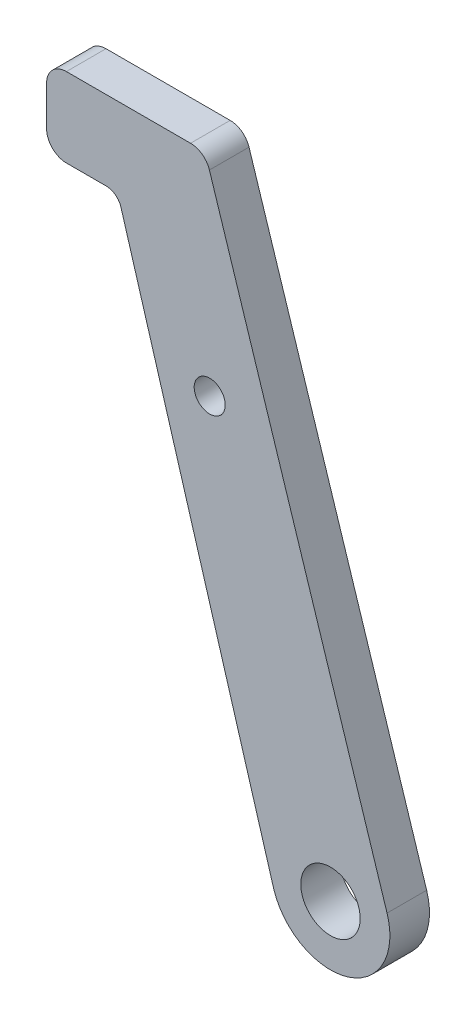
ISO-10303-21;
HEADER;
FILE_DESCRIPTION(('STEP AP214'),'2;1');
FILE_NAME('part.step','',(''),(''),'','','');
FILE_SCHEMA(('AUTOMOTIVE_DESIGN { 1 0 10303 214 1 1 1 1 }'));
ENDSEC;
DATA;
#1=APPLICATION_CONTEXT('core data for automotive mechanical design processes');
#2=APPLICATION_PROTOCOL_DEFINITION('international standard','automotive_design',2000,#1);
#3=PRODUCT_CONTEXT('',#1,'mechanical');
#4=PRODUCT('Part','Part','',(#3));
#5=PRODUCT_RELATED_PRODUCT_CATEGORY('part','',(#4));
#6=PRODUCT_DEFINITION_FORMATION('','',#4);
#7=PRODUCT_DEFINITION_CONTEXT('part definition',#1,'design');
#8=PRODUCT_DEFINITION('design','',#6,#7);
#9=PRODUCT_DEFINITION_SHAPE('','',#8);
#10=(LENGTH_UNIT() NAMED_UNIT(*) SI_UNIT(.MILLI.,.METRE.));
#11=(NAMED_UNIT(*) PLANE_ANGLE_UNIT() SI_UNIT($,.RADIAN.));
#12=(NAMED_UNIT(*) SI_UNIT($,.STERADIAN.) SOLID_ANGLE_UNIT());
#13=UNCERTAINTY_MEASURE_WITH_UNIT(LENGTH_MEASURE(1.E-05),#10,'distance_accuracy_value','');
#14=(GEOMETRIC_REPRESENTATION_CONTEXT(3) GLOBAL_UNCERTAINTY_ASSIGNED_CONTEXT((#13)) GLOBAL_UNIT_ASSIGNED_CONTEXT((#10,
#11,#12)) REPRESENTATION_CONTEXT('',''));
#15=CARTESIAN_POINT('',(0.,0.,0.));
#16=DIRECTION('',(0.,0.,1.));
#17=DIRECTION('',(1.,0.,0.));
#18=AXIS2_PLACEMENT_3D('',#15,#16,#17);
#19=CARTESIAN_POINT('',(56.5878202370331,645.1727,-6.35));
#20=DIRECTION('',(0.,1.,0.));
#21=DIRECTION('',(0.,0.,1.));
#22=AXIS2_PLACEMENT_3D('',#19,#20,#21);
#23=PLANE('',#22);
#24=DIRECTION('',(-1.,0.,0.));
#25=VECTOR('',#24,1.);
#26=CARTESIAN_POINT('',(56.5878202370331,645.1727,0.));
#27=LINE('',#26,#25);
#28=CARTESIAN_POINT('',(79.670778121342,645.1727,0.));
#29=VERTEX_POINT('',#28);
#30=CARTESIAN_POINT('',(59.7628202370331,645.1727,0.));
#31=VERTEX_POINT('',#30);
#32=EDGE_CURVE('E163',#29,#31,#27,.T.);
#33=ORIENTED_EDGE('',*,*,#32,.F.);
#34=DIRECTION('',(0.,0.,1.));
#35=VECTOR('',#34,1.);
#36=CARTESIAN_POINT('',(79.670778121342,645.1727,-6.35));
#37=LINE('',#36,#35);
#38=CARTESIAN_POINT('',(79.670778121342,645.1727,-6.35));
#39=VERTEX_POINT('',#38);
#40=EDGE_CURVE('E11',#29,#39,#37,.F.);
#41=ORIENTED_EDGE('',*,*,#40,.T.);
#42=DIRECTION('',(-1.,0.,0.));
#43=VECTOR('',#42,1.);
#44=CARTESIAN_POINT('',(56.5878202370331,645.1727,-6.35));
#45=LINE('',#44,#43);
#46=CARTESIAN_POINT('',(59.7628202370331,645.1727,-6.35));
#47=VERTEX_POINT('',#46);
#48=EDGE_CURVE('E184',#39,#47,#45,.T.);
#49=ORIENTED_EDGE('',*,*,#48,.T.);
#50=DIRECTION('',(0.,0.,1.));
#51=VECTOR('',#50,1.);
#52=CARTESIAN_POINT('',(59.7628202370331,645.1727,-6.35));
#53=LINE('',#52,#51);
#54=EDGE_CURVE('E47',#47,#31,#53,.T.);
#55=ORIENTED_EDGE('',*,*,#54,.T.);
#56=EDGE_LOOP('',(#33,#41,#49,#55));
#57=FACE_BOUND('',#56,.T.);
#58=ADVANCED_FACE('F39',(#57),#23,.T.);
#59=CARTESIAN_POINT('',(81.987820237033,645.1727,-6.35));
#60=DIRECTION('',(0.952354391814923,0.304993626803623,0.));
#61=DIRECTION('',(-0.304993626803623,0.952354391814923,0.));
#62=AXIS2_PLACEMENT_3D('',#59,#60,#61);
#63=PLANE('',#62);
#64=DIRECTION('',(-0.304993626803623,0.952354391814923,0.));
#65=VECTOR('',#64,1.);
#66=CARTESIAN_POINT('',(81.987820237033,645.1727,-6.35));
#67=LINE('',#66,#65);
#68=CARTESIAN_POINT('',(111.179175582037,554.021564295304,-6.35));
#69=VERTEX_POINT('',#68);
#70=CARTESIAN_POINT('',(82.6945033153544,642.966054765101,-6.35));
#71=VERTEX_POINT('',#70);
#72=EDGE_CURVE('E148',#69,#71,#67,.T.);
#73=ORIENTED_EDGE('',*,*,#72,.T.);
#74=DIRECTION('',(0.,0.,1.));
#75=VECTOR('',#74,1.);
#76=CARTESIAN_POINT('',(82.6945033153544,642.966054765101,-6.35));
#77=LINE('',#76,#75);
#78=CARTESIAN_POINT('',(82.6945033153544,642.966054765101,0.));
#79=VERTEX_POINT('',#78);
#80=EDGE_CURVE('E216',#71,#79,#77,.T.);
#81=ORIENTED_EDGE('',*,*,#80,.T.);
#82=DIRECTION('',(-0.304993626803623,0.952354391814923,0.));
#83=VECTOR('',#82,1.);
#84=CARTESIAN_POINT('',(81.987820237033,645.1727,0.));
#85=LINE('',#84,#83);
#86=CARTESIAN_POINT('',(111.179175582037,554.021564295304,0.));
#87=VERTEX_POINT('',#86);
#88=EDGE_CURVE('E181',#87,#79,#85,.T.);
#89=ORIENTED_EDGE('',*,*,#88,.F.);
#90=DIRECTION('',(0.,0.,1.));
#91=VECTOR('',#90,1.);
#92=CARTESIAN_POINT('',(111.179175582037,554.021564295304,-6.35));
#93=LINE('',#92,#91);
#94=EDGE_CURVE('E185',#69,#87,#93,.T.);
#95=ORIENTED_EDGE('',*,*,#94,.F.);
#96=EDGE_LOOP('',(#73,#81,#89,#95));
#97=FACE_BOUND('',#96,.T.);
#98=ADVANCED_FACE('F236',(#97),#63,.T.);
#99=CARTESIAN_POINT('',(102.108,551.1165,-6.35));
#100=DIRECTION('',(0.,0.,1.));
#101=DIRECTION('',(1.,0.,0.));
#102=AXIS2_PLACEMENT_3D('',#99,#100,#101);
#103=CYLINDRICAL_SURFACE('',#102,9.52500000000003);
#104=CARTESIAN_POINT('',(102.108,551.1165,0.));
#105=DIRECTION('',(0.,0.,1.));
#106=DIRECTION('',(1.,0.,0.));
#107=AXIS2_PLACEMENT_3D('',#104,#105,#106);
#108=CIRCLE('',#107,9.52500000000003);
#109=CARTESIAN_POINT('',(93.0368244179624,548.211435704695,0.));
#110=VERTEX_POINT('',#109);
#111=EDGE_CURVE('E178',#110,#87,#108,.T.);
#112=ORIENTED_EDGE('',*,*,#111,.F.);
#113=DIRECTION('',(0.,0.,1.));
#114=VECTOR('',#113,1.);
#115=CARTESIAN_POINT('',(93.0368244179624,548.211435704695,-6.35));
#116=LINE('',#115,#114);
#117=CARTESIAN_POINT('',(93.0368244179624,548.211435704695,-6.35));
#118=VERTEX_POINT('',#117);
#119=EDGE_CURVE('E188',#118,#110,#116,.T.);
#120=ORIENTED_EDGE('',*,*,#119,.F.);
#121=CARTESIAN_POINT('',(102.108,551.1165,-6.35));
#122=DIRECTION('',(0.,0.,1.));
#123=DIRECTION('',(1.,0.,0.));
#124=AXIS2_PLACEMENT_3D('',#121,#122,#123);
#125=CIRCLE('',#124,9.52500000000003);
#126=EDGE_CURVE('E158',#118,#69,#125,.T.);
#127=ORIENTED_EDGE('',*,*,#126,.T.);
#128=ORIENTED_EDGE('',*,*,#94,.T.);
#129=EDGE_LOOP('',(#112,#120,#127,#128));
#130=FACE_BOUND('',#129,.T.);
#131=ADVANCED_FACE('F283',(#130),#103,.T.);
#132=CARTESIAN_POINT('',(93.0368244179624,548.211435704695,-6.35));
#133=DIRECTION('',(-0.9523543918149,-0.304993626803696,0.));
#134=DIRECTION('',(0.304993626803696,-0.9523543918149,0.));
#135=AXIS2_PLACEMENT_3D('',#132,#133,#134);
#136=PLANE('',#135);
#137=DIRECTION('',(0.304993626803696,-0.9523543918149,0.));
#138=VECTOR('',#137,1.);
#139=CARTESIAN_POINT('',(93.0368244179624,548.211435704695,0.));
#140=LINE('',#139,#138);
#141=CARTESIAN_POINT('',(93.0164969595132,548.274908979634,0.));
#142=VERTEX_POINT('',#141);
#143=EDGE_CURVE('E176',#142,#110,#140,.T.);
#144=ORIENTED_EDGE('',*,*,#143,.F.);
#145=DIRECTION('',(0.,0.,1.));
#146=VECTOR('',#145,1.);
#147=CARTESIAN_POINT('',(93.0164969595132,548.274908979634,-6.35));
#148=LINE('',#147,#146);
#149=CARTESIAN_POINT('',(93.0164969595132,548.274908979634,-6.35));
#150=VERTEX_POINT('',#149);
#151=EDGE_CURVE('E62',#142,#150,#148,.F.);
#152=ORIENTED_EDGE('',*,*,#151,.T.);
#153=DIRECTION('',(0.304993626803696,-0.9523543918149,0.));
#154=VECTOR('',#153,1.);
#155=CARTESIAN_POINT('',(93.0368244179624,548.211435704695,-6.35));
#156=LINE('',#155,#154);
#157=EDGE_CURVE('E153',#150,#118,#156,.T.);
#158=ORIENTED_EDGE('',*,*,#157,.T.);
#159=ORIENTED_EDGE('',*,*,#119,.T.);
#160=EDGE_LOOP('',(#144,#152,#158,#159));
#161=FACE_BOUND('',#160,.T.);
#162=ADVANCED_FACE('F309',(#161),#136,.T.);
#163=CARTESIAN_POINT('',(93.0063332302884,548.306645617103,-6.35));
#164=DIRECTION('',(-0.95854622969434,-0.284937055397793,0.));
#165=DIRECTION('',(0.284937055397793,-0.958546229694341,0.));
#166=AXIS2_PLACEMENT_3D('',#163,#164,#165);
#167=PLANE('',#166);
#168=DIRECTION('',(0.284937055397793,-0.95854622969434,0.));
#169=VECTOR('',#168,1.);
#170=CARTESIAN_POINT('',(93.0063332302884,548.306645617103,-6.35));
#171=LINE('',#170,#169);
#172=CARTESIAN_POINT('',(68.5162693960239,630.692765318296,-6.35));
#173=VERTEX_POINT('',#172);
#174=CARTESIAN_POINT('',(92.996837874246,548.338588593847,-6.35));
#175=VERTEX_POINT('',#174);
#176=EDGE_CURVE('E151',#173,#175,#171,.T.);
#177=ORIENTED_EDGE('',*,*,#176,.T.);
#178=DIRECTION('',(0.,0.,1.));
#179=VECTOR('',#178,1.);
#180=CARTESIAN_POINT('',(92.996837874246,548.338588593847,-6.35));
#181=LINE('',#180,#179);
#182=CARTESIAN_POINT('',(92.996837874246,548.338588593847,0.));
#183=VERTEX_POINT('',#182);
#184=EDGE_CURVE('E212',#175,#183,#181,.T.);
#185=ORIENTED_EDGE('',*,*,#184,.T.);
#186=DIRECTION('',(0.284937055397793,-0.95854622969434,0.));
#187=VECTOR('',#186,1.);
#188=CARTESIAN_POINT('',(93.0063332302884,548.306645617103,0.));
#189=LINE('',#188,#187);
#190=CARTESIAN_POINT('',(68.5162693960239,630.692765318296,0.));
#191=VERTEX_POINT('',#190);
#192=EDGE_CURVE('E173',#191,#183,#189,.T.);
#193=ORIENTED_EDGE('',*,*,#192,.F.);
#194=DIRECTION('',(0.,0.,1.));
#195=VECTOR('',#194,1.);
#196=CARTESIAN_POINT('',(68.5162693960239,630.692765318296,-6.35));
#197=LINE('',#196,#195);
#198=EDGE_CURVE('E147',#173,#191,#197,.T.);
#199=ORIENTED_EDGE('',*,*,#198,.F.);
#200=EDGE_LOOP('',(#177,#185,#193,#199));
#201=FACE_BOUND('',#200,.T.);
#202=ADVANCED_FACE('F306',(#201),#167,.T.);
#203=CARTESIAN_POINT('',(66.1302561210688,629.9835,-6.35));
#204=DIRECTION('',(0.,0.,1.));
#205=DIRECTION('',(1.,0.,0.));
#206=AXIS2_PLACEMENT_3D('',#203,#204,#205);
#207=CYLINDRICAL_SURFACE('',#206,2.48919999999997);
#208=CARTESIAN_POINT('',(66.1302561210688,629.9835,0.));
#209=DIRECTION('',(0.,0.,-1.));
#210=DIRECTION('',(1.,0.,0.));
#211=AXIS2_PLACEMENT_3D('',#208,#209,#210);
#212=CIRCLE('',#211,2.48919999999997);
#213=CARTESIAN_POINT('',(66.1302561210688,632.4727,0.));
#214=VERTEX_POINT('',#213);
#215=EDGE_CURVE('E146',#214,#191,#212,.T.);
#216=ORIENTED_EDGE('',*,*,#215,.F.);
#217=DIRECTION('',(0.,0.,1.));
#218=VECTOR('',#217,1.);
#219=CARTESIAN_POINT('',(66.1302561210688,632.4727,-6.35));
#220=LINE('',#219,#218);
#221=CARTESIAN_POINT('',(66.1302561210688,632.4727,-6.35));
#222=VERTEX_POINT('',#221);
#223=EDGE_CURVE('E133',#222,#214,#220,.T.);
#224=ORIENTED_EDGE('',*,*,#223,.F.);
#225=CARTESIAN_POINT('',(66.1302561210688,629.9835,-6.35));
#226=DIRECTION('',(0.,0.,-1.));
#227=DIRECTION('',(1.,0.,0.));
#228=AXIS2_PLACEMENT_3D('',#225,#226,#227);
#229=CIRCLE('',#228,2.48919999999997);
#230=EDGE_CURVE('E139',#222,#173,#229,.T.);
#231=ORIENTED_EDGE('',*,*,#230,.T.);
#232=ORIENTED_EDGE('',*,*,#198,.T.);
#233=EDGE_LOOP('',(#216,#224,#231,#232));
#234=FACE_BOUND('',#233,.T.);
#235=ADVANCED_FACE('F144',(#234),#207,.F.);
#236=CARTESIAN_POINT('',(66.1302561210688,632.4727,-6.35));
#237=DIRECTION('',(0.,-1.,0.));
#238=DIRECTION('',(1.,0.,0.));
#239=AXIS2_PLACEMENT_3D('',#236,#237,#238);
#240=PLANE('',#239);
#241=DIRECTION('',(1.,0.,0.));
#242=VECTOR('',#241,1.);
#243=CARTESIAN_POINT('',(66.1302561210688,632.4727,0.));
#244=LINE('',#243,#242);
#245=CARTESIAN_POINT('',(59.762820237033,632.4727,0.));
#246=VERTEX_POINT('',#245);
#247=EDGE_CURVE('E170',#246,#214,#244,.T.);
#248=ORIENTED_EDGE('',*,*,#247,.F.);
#249=DIRECTION('',(0.,0.,1.));
#250=VECTOR('',#249,1.);
#251=CARTESIAN_POINT('',(59.762820237033,632.4727,-6.35));
#252=LINE('',#251,#250);
#253=CARTESIAN_POINT('',(59.762820237033,632.4727,-6.35));
#254=VERTEX_POINT('',#253);
#255=EDGE_CURVE('E136',#246,#254,#252,.F.);
#256=ORIENTED_EDGE('',*,*,#255,.T.);
#257=DIRECTION('',(1.,0.,0.));
#258=VECTOR('',#257,1.);
#259=CARTESIAN_POINT('',(66.1302561210688,632.4727,-6.35));
#260=LINE('',#259,#258);
#261=EDGE_CURVE('E129',#254,#222,#260,.T.);
#262=ORIENTED_EDGE('',*,*,#261,.T.);
#263=ORIENTED_EDGE('',*,*,#223,.T.);
#264=EDGE_LOOP('',(#248,#256,#262,#263));
#265=FACE_BOUND('',#264,.T.);
#266=ADVANCED_FACE('F132',(#265),#240,.T.);
#267=CARTESIAN_POINT('',(56.5878202370331,632.4727,-6.35));
#268=DIRECTION('',(-1.,0.,0.));
#269=DIRECTION('',(0.,0.,1.));
#270=AXIS2_PLACEMENT_3D('',#267,#268,#269);
#271=PLANE('',#270);
#272=DIRECTION('',(0.,-1.,0.));
#273=VECTOR('',#272,1.);
#274=CARTESIAN_POINT('',(56.5878202370331,632.4727,-6.35));
#275=LINE('',#274,#273);
#276=CARTESIAN_POINT('',(56.5878202370331,641.9977,-6.35));
#277=VERTEX_POINT('',#276);
#278=CARTESIAN_POINT('',(56.5878202370331,635.6477,-6.35));
#279=VERTEX_POINT('',#278);
#280=EDGE_CURVE('E140',#277,#279,#275,.T.);
#281=ORIENTED_EDGE('',*,*,#280,.T.);
#282=DIRECTION('',(0.,0.,1.));
#283=VECTOR('',#282,1.);
#284=CARTESIAN_POINT('',(56.5878202370331,635.6477,-6.35));
#285=LINE('',#284,#283);
#286=CARTESIAN_POINT('',(56.5878202370331,635.6477,0.));
#287=VERTEX_POINT('',#286);
#288=EDGE_CURVE('E193',#279,#287,#285,.T.);
#289=ORIENTED_EDGE('',*,*,#288,.T.);
#290=DIRECTION('',(0.,-1.,0.));
#291=VECTOR('',#290,1.);
#292=CARTESIAN_POINT('',(56.5878202370331,632.4727,0.));
#293=LINE('',#292,#291);
#294=CARTESIAN_POINT('',(56.5878202370331,641.9977,0.));
#295=VERTEX_POINT('',#294);
#296=EDGE_CURVE('E166',#295,#287,#293,.T.);
#297=ORIENTED_EDGE('',*,*,#296,.F.);
#298=DIRECTION('',(0.,0.,1.));
#299=VECTOR('',#298,1.);
#300=CARTESIAN_POINT('',(56.5878202370331,641.9977,-6.35));
#301=LINE('',#300,#299);
#302=EDGE_CURVE('E187',#295,#277,#301,.F.);
#303=ORIENTED_EDGE('',*,*,#302,.T.);
#304=EDGE_LOOP('',(#281,#289,#297,#303));
#305=FACE_BOUND('',#304,.T.);
#306=ADVANCED_FACE('F287',(#305),#271,.T.);
#307=CARTESIAN_POINT('',(102.108,551.1165,-6.35));
#308=DIRECTION('',(0.,0.,1.));
#309=DIRECTION('',(1.,0.,0.));
#310=AXIS2_PLACEMENT_3D('',#307,#308,#309);
#311=PLANE('',#310);
#312=CARTESIAN_POINT('',(82.7409046979693,611.591003880247,-6.35));
#313=DIRECTION('',(0.,0.,1.));
#314=DIRECTION('',(1.,0.,0.));
#315=AXIS2_PLACEMENT_3D('',#312,#313,#314);
#316=CIRCLE('',#315,2.48920000000025);
#317=CARTESIAN_POINT('',(85.2301046979696,611.591003880247,-6.35));
#318=VERTEX_POINT('',#317);
#319=EDGE_CURVE('E246',#318,#318,#316,.T.);
#320=ORIENTED_EDGE('',*,*,#319,.T.);
#321=EDGE_LOOP('',(#320));
#322=FACE_BOUND('',#321,.T.);
#323=CARTESIAN_POINT('',(102.108,551.1165,-6.35));
#324=DIRECTION('',(0.,0.,1.));
#325=DIRECTION('',(1.,0.,0.));
#326=AXIS2_PLACEMENT_3D('',#323,#324,#325);
#327=CIRCLE('',#326,4.76250000000008);
#328=CARTESIAN_POINT('',(106.8705,551.1165,-6.35));
#329=VERTEX_POINT('',#328);
#330=EDGE_CURVE('E167',#329,#329,#327,.T.);
#331=ORIENTED_EDGE('',*,*,#330,.T.);
#332=EDGE_LOOP('',(#331));
#333=FACE_BOUND('',#332,.T.);
#334=ORIENTED_EDGE('',*,*,#261,.F.);
#335=CARTESIAN_POINT('',(59.7628202370331,635.6477,-6.35));
#336=DIRECTION('',(0.,0.,1.));
#337=DIRECTION('',(1.,0.,0.));
#338=AXIS2_PLACEMENT_3D('',#335,#336,#337);
#339=CIRCLE('',#338,3.175);
#340=EDGE_CURVE('E210',#254,#279,#339,.F.);
#341=ORIENTED_EDGE('',*,*,#340,.T.);
#342=ORIENTED_EDGE('',*,*,#280,.F.);
#343=CARTESIAN_POINT('',(59.7628202370331,641.9977,-6.35));
#344=DIRECTION('',(0.,0.,1.));
#345=DIRECTION('',(1.,0.,0.));
#346=AXIS2_PLACEMENT_3D('',#343,#344,#345);
#347=CIRCLE('',#346,3.175);
#348=EDGE_CURVE('E205',#277,#47,#347,.F.);
#349=ORIENTED_EDGE('',*,*,#348,.T.);
#350=ORIENTED_EDGE('',*,*,#48,.F.);
#351=CARTESIAN_POINT('',(79.670778121342,641.9977,-6.35));
#352=DIRECTION('',(0.,0.,1.));
#353=DIRECTION('',(1.,0.,0.));
#354=AXIS2_PLACEMENT_3D('',#351,#352,#353);
#355=CIRCLE('',#354,3.175);
#356=EDGE_CURVE('E207',#39,#71,#355,.F.);
#357=ORIENTED_EDGE('',*,*,#356,.T.);
#358=ORIENTED_EDGE('',*,*,#72,.F.);
#359=ORIENTED_EDGE('',*,*,#126,.F.);
#360=ORIENTED_EDGE('',*,*,#157,.F.);
#361=CARTESIAN_POINT('',(96.0402221535255,549.243263744735,-6.35));
#362=DIRECTION('',(0.,0.,1.));
#363=DIRECTION('',(1.,0.,0.));
#364=AXIS2_PLACEMENT_3D('',#361,#362,#363);
#365=CIRCLE('',#364,3.175);
#366=EDGE_CURVE('E54',#150,#175,#365,.F.);
#367=ORIENTED_EDGE('',*,*,#366,.T.);
#368=ORIENTED_EDGE('',*,*,#176,.F.);
#369=ORIENTED_EDGE('',*,*,#230,.F.);
#370=EDGE_LOOP('',(#334,#341,#342,#349,#350,#357,#358,#359,#360,#367,#368,#369));
#371=FACE_BOUND('',#370,.T.);
#372=ADVANCED_FACE('F150',(#322,#333,#371),#311,.F.);
#373=CARTESIAN_POINT('',(102.108,551.1165,0.));
#374=DIRECTION('',(0.,0.,1.));
#375=DIRECTION('',(1.,0.,0.));
#376=AXIS2_PLACEMENT_3D('',#373,#374,#375);
#377=PLANE('',#376);
#378=CARTESIAN_POINT('',(82.7409046979693,611.591003880247,0.));
#379=DIRECTION('',(0.,0.,1.));
#380=DIRECTION('',(1.,0.,0.));
#381=AXIS2_PLACEMENT_3D('',#378,#379,#380);
#382=CIRCLE('',#381,2.48920000000025);
#383=CARTESIAN_POINT('',(85.2301046979696,611.591003880247,0.));
#384=VERTEX_POINT('',#383);
#385=EDGE_CURVE('E249',#384,#384,#382,.T.);
#386=ORIENTED_EDGE('',*,*,#385,.F.);
#387=EDGE_LOOP('',(#386));
#388=FACE_BOUND('',#387,.T.);
#389=CARTESIAN_POINT('',(102.108,551.1165,0.));
#390=DIRECTION('',(0.,0.,1.));
#391=DIRECTION('',(1.,0.,0.));
#392=AXIS2_PLACEMENT_3D('',#389,#390,#391);
#393=CIRCLE('',#392,4.76250000000008);
#394=CARTESIAN_POINT('',(106.8705,551.1165,0.));
#395=VERTEX_POINT('',#394);
#396=EDGE_CURVE('E243',#395,#395,#393,.T.);
#397=ORIENTED_EDGE('',*,*,#396,.F.);
#398=EDGE_LOOP('',(#397));
#399=FACE_BOUND('',#398,.T.);
#400=ORIENTED_EDGE('',*,*,#296,.T.);
#401=CARTESIAN_POINT('',(59.7628202370331,635.6477,0.));
#402=DIRECTION('',(0.,0.,1.));
#403=DIRECTION('',(1.,0.,0.));
#404=AXIS2_PLACEMENT_3D('',#401,#402,#403);
#405=CIRCLE('',#404,3.175);
#406=EDGE_CURVE('E202',#287,#246,#405,.T.);
#407=ORIENTED_EDGE('',*,*,#406,.T.);
#408=ORIENTED_EDGE('',*,*,#247,.T.);
#409=ORIENTED_EDGE('',*,*,#215,.T.);
#410=ORIENTED_EDGE('',*,*,#192,.T.);
#411=CARTESIAN_POINT('',(96.0402221535255,549.243263744735,0.));
#412=DIRECTION('',(0.,0.,1.));
#413=DIRECTION('',(1.,0.,0.));
#414=AXIS2_PLACEMENT_3D('',#411,#412,#413);
#415=CIRCLE('',#414,3.175);
#416=EDGE_CURVE('E200',#183,#142,#415,.T.);
#417=ORIENTED_EDGE('',*,*,#416,.T.);
#418=ORIENTED_EDGE('',*,*,#143,.T.);
#419=ORIENTED_EDGE('',*,*,#111,.T.);
#420=ORIENTED_EDGE('',*,*,#88,.T.);
#421=CARTESIAN_POINT('',(79.670778121342,641.9977,0.));
#422=DIRECTION('',(0.,0.,1.));
#423=DIRECTION('',(1.,0.,0.));
#424=AXIS2_PLACEMENT_3D('',#421,#422,#423);
#425=CIRCLE('',#424,3.175);
#426=EDGE_CURVE('E198',#79,#29,#425,.T.);
#427=ORIENTED_EDGE('',*,*,#426,.T.);
#428=ORIENTED_EDGE('',*,*,#32,.T.);
#429=CARTESIAN_POINT('',(59.7628202370331,641.9977,0.));
#430=DIRECTION('',(0.,0.,1.));
#431=DIRECTION('',(1.,0.,0.));
#432=AXIS2_PLACEMENT_3D('',#429,#430,#431);
#433=CIRCLE('',#432,3.175);
#434=EDGE_CURVE('E196',#31,#295,#433,.T.);
#435=ORIENTED_EDGE('',*,*,#434,.T.);
#436=EDGE_LOOP('',(#400,#407,#408,#409,#410,#417,#418,#419,#420,#427,#428,#435));
#437=FACE_BOUND('',#436,.T.);
#438=ADVANCED_FACE('F228',(#388,#399,#437),#377,.T.);
#439=CARTESIAN_POINT('',(102.108,551.1165,-6.35));
#440=DIRECTION('',(0.,0.,1.));
#441=DIRECTION('',(1.,0.,0.));
#442=AXIS2_PLACEMENT_3D('',#439,#440,#441);
#443=CYLINDRICAL_SURFACE('',#442,4.76250000000008);
#444=ORIENTED_EDGE('',*,*,#330,.F.);
#445=EDGE_LOOP('',(#444));
#446=FACE_BOUND('',#445,.T.);
#447=ORIENTED_EDGE('',*,*,#396,.T.);
#448=EDGE_LOOP('',(#447));
#449=FACE_BOUND('',#448,.T.);
#450=ADVANCED_FACE('F261',(#446,#449),#443,.F.);
#451=CARTESIAN_POINT('',(82.7409046979693,611.591003880247,-6.35));
#452=DIRECTION('',(0.,0.,1.));
#453=DIRECTION('',(1.,0.,0.));
#454=AXIS2_PLACEMENT_3D('',#451,#452,#453);
#455=CYLINDRICAL_SURFACE('',#454,2.48920000000025);
#456=ORIENTED_EDGE('',*,*,#319,.F.);
#457=EDGE_LOOP('',(#456));
#458=FACE_BOUND('',#457,.T.);
#459=ORIENTED_EDGE('',*,*,#385,.T.);
#460=EDGE_LOOP('',(#459));
#461=FACE_BOUND('',#460,.T.);
#462=ADVANCED_FACE('F257',(#458,#461),#455,.F.);
#463=CARTESIAN_POINT('',(59.7628202370331,635.6477,-6.35));
#464=DIRECTION('',(0.,0.,1.));
#465=DIRECTION('',(1.,0.,0.));
#466=AXIS2_PLACEMENT_3D('',#463,#464,#465);
#467=CYLINDRICAL_SURFACE('',#466,3.175);
#468=ORIENTED_EDGE('',*,*,#340,.F.);
#469=ORIENTED_EDGE('',*,*,#255,.F.);
#470=ORIENTED_EDGE('',*,*,#406,.F.);
#471=ORIENTED_EDGE('',*,*,#288,.F.);
#472=EDGE_LOOP('',(#468,#469,#470,#471));
#473=FACE_BOUND('',#472,.T.);
#474=ADVANCED_FACE('F260',(#473),#467,.T.);
#475=CARTESIAN_POINT('',(96.0402221535255,549.243263744735,-6.35));
#476=DIRECTION('',(0.,0.,1.));
#477=DIRECTION('',(1.,0.,0.));
#478=AXIS2_PLACEMENT_3D('',#475,#476,#477);
#479=CYLINDRICAL_SURFACE('',#478,3.175);
#480=ORIENTED_EDGE('',*,*,#366,.F.);
#481=ORIENTED_EDGE('',*,*,#151,.F.);
#482=ORIENTED_EDGE('',*,*,#416,.F.);
#483=ORIENTED_EDGE('',*,*,#184,.F.);
#484=EDGE_LOOP('',(#480,#481,#482,#483));
#485=FACE_BOUND('',#484,.T.);
#486=ADVANCED_FACE('F291',(#485),#479,.T.);
#487=CARTESIAN_POINT('',(79.670778121342,641.9977,-6.35));
#488=DIRECTION('',(0.,0.,1.));
#489=DIRECTION('',(1.,0.,0.));
#490=AXIS2_PLACEMENT_3D('',#487,#488,#489);
#491=CYLINDRICAL_SURFACE('',#490,3.175);
#492=ORIENTED_EDGE('',*,*,#356,.F.);
#493=ORIENTED_EDGE('',*,*,#40,.F.);
#494=ORIENTED_EDGE('',*,*,#426,.F.);
#495=ORIENTED_EDGE('',*,*,#80,.F.);
#496=EDGE_LOOP('',(#492,#493,#494,#495));
#497=FACE_BOUND('',#496,.T.);
#498=ADVANCED_FACE('F234',(#497),#491,.T.);
#499=CARTESIAN_POINT('',(59.7628202370331,641.9977,-6.35));
#500=DIRECTION('',(0.,0.,1.));
#501=DIRECTION('',(1.,0.,0.));
#502=AXIS2_PLACEMENT_3D('',#499,#500,#501);
#503=CYLINDRICAL_SURFACE('',#502,3.175);
#504=ORIENTED_EDGE('',*,*,#348,.F.);
#505=ORIENTED_EDGE('',*,*,#302,.F.);
#506=ORIENTED_EDGE('',*,*,#434,.F.);
#507=ORIENTED_EDGE('',*,*,#54,.F.);
#508=EDGE_LOOP('',(#504,#505,#506,#507));
#509=FACE_BOUND('',#508,.T.);
#510=ADVANCED_FACE('F41',(#509),#503,.T.);
#511=CLOSED_SHELL('',(#58,#98,#131,#162,#202,#235,#266,#306,#372,#438,#450,#462,#474,#486,#498,#510));
#512=MANIFOLD_SOLID_BREP('B2',#511);
#513=ADVANCED_BREP_SHAPE_REPRESENTATION('',(#18,#512),#14);
#514=SHAPE_DEFINITION_REPRESENTATION(#9,#513);
ENDSEC;
END-ISO-10303-21;
